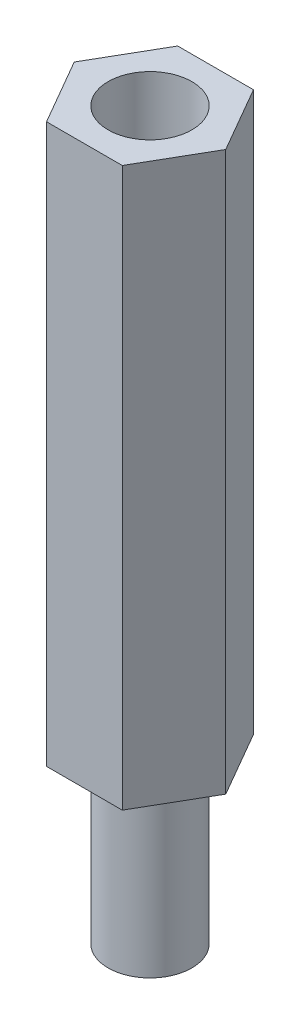
ISO-10303-21;
HEADER;
FILE_DESCRIPTION(('STEP AP214'),'2;1');
FILE_NAME('part.step','',(''),(''),'','','');
FILE_SCHEMA(('AUTOMOTIVE_DESIGN { 1 0 10303 214 1 1 1 1 }'));
ENDSEC;
DATA;
#1=APPLICATION_CONTEXT('core data for automotive mechanical design processes');
#2=APPLICATION_PROTOCOL_DEFINITION('international standard','automotive_design',2000,#1);
#3=PRODUCT_CONTEXT('',#1,'mechanical');
#4=PRODUCT('Part','Part','',(#3));
#5=PRODUCT_RELATED_PRODUCT_CATEGORY('part','',(#4));
#6=PRODUCT_DEFINITION_FORMATION('','',#4);
#7=PRODUCT_DEFINITION_CONTEXT('part definition',#1,'design');
#8=PRODUCT_DEFINITION('design','',#6,#7);
#9=PRODUCT_DEFINITION_SHAPE('','',#8);
#10=(LENGTH_UNIT() NAMED_UNIT(*) SI_UNIT(.MILLI.,.METRE.));
#11=(NAMED_UNIT(*) PLANE_ANGLE_UNIT() SI_UNIT($,.RADIAN.));
#12=(NAMED_UNIT(*) SI_UNIT($,.STERADIAN.) SOLID_ANGLE_UNIT());
#13=UNCERTAINTY_MEASURE_WITH_UNIT(LENGTH_MEASURE(1.E-05),#10,'distance_accuracy_value','');
#14=(GEOMETRIC_REPRESENTATION_CONTEXT(3) GLOBAL_UNCERTAINTY_ASSIGNED_CONTEXT((#13)) GLOBAL_UNIT_ASSIGNED_CONTEXT((#10,
#11,#12)) REPRESENTATION_CONTEXT('',''));
#15=CARTESIAN_POINT('',(0.,0.,0.));
#16=DIRECTION('',(0.,0.,1.));
#17=DIRECTION('',(1.,0.,0.));
#18=AXIS2_PLACEMENT_3D('',#15,#16,#17);
#19=CARTESIAN_POINT('',(0.,-6.,0.));
#20=DIRECTION('',(0.,1.,0.));
#21=DIRECTION('',(0.,0.,1.));
#22=AXIS2_PLACEMENT_3D('',#19,#20,#21);
#23=CYLINDRICAL_SURFACE('',#22,1.5);
#24=CARTESIAN_POINT('',(0.,-6.,0.));
#25=DIRECTION('',(0.,-1.,0.));
#26=DIRECTION('',(0.,0.,-1.));
#27=AXIS2_PLACEMENT_3D('',#24,#25,#26);
#28=CIRCLE('',#27,1.5);
#29=CARTESIAN_POINT('',(0.,-6.,-1.5));
#30=VERTEX_POINT('',#29);
#31=EDGE_CURVE('E11',#30,#30,#28,.T.);
#32=ORIENTED_EDGE('',*,*,#31,.F.);
#33=EDGE_LOOP('',(#32));
#34=FACE_BOUND('',#33,.T.);
#35=CARTESIAN_POINT('',(0.,0.,0.));
#36=DIRECTION('',(0.,-1.,0.));
#37=DIRECTION('',(0.,0.,-1.));
#38=AXIS2_PLACEMENT_3D('',#35,#36,#37);
#39=CIRCLE('',#38,1.5);
#40=CARTESIAN_POINT('',(0.,0.,-1.5));
#41=VERTEX_POINT('',#40);
#42=EDGE_CURVE('E46',#41,#41,#39,.T.);
#43=ORIENTED_EDGE('',*,*,#42,.T.);
#44=EDGE_LOOP('',(#43));
#45=FACE_BOUND('',#44,.T.);
#46=ADVANCED_FACE('F43',(#34,#45),#23,.T.);
#47=CARTESIAN_POINT('',(0.,-6.,0.));
#48=DIRECTION('',(0.,-1.,0.));
#49=DIRECTION('',(0.,0.,-1.));
#50=AXIS2_PLACEMENT_3D('',#47,#48,#49);
#51=PLANE('',#50);
#52=ORIENTED_EDGE('',*,*,#31,.T.);
#53=EDGE_LOOP('',(#52));
#54=FACE_BOUND('',#53,.T.);
#55=ADVANCED_FACE('F58',(#54),#51,.T.);
#56=CARTESIAN_POINT('',(0.,0.,0.));
#57=DIRECTION('',(0.,-1.,0.));
#58=DIRECTION('',(0.,0.,-1.));
#59=AXIS2_PLACEMENT_3D('',#56,#57,#58);
#60=PLANE('',#59);
#61=ORIENTED_EDGE('',*,*,#42,.F.);
#62=EDGE_LOOP('',(#61));
#63=FACE_BOUND('',#62,.T.);
#64=ADVANCED_FACE('F56',(#63),#60,.F.);
#65=CLOSED_SHELL('',(#46,#55,#64));
#66=MANIFOLD_SOLID_BREP('B2',#65);
#67=CARTESIAN_POINT('',(0.,20.,0.));
#68=DIRECTION('',(0.,1.,0.));
#69=DIRECTION('',(0.,0.,1.));
#70=AXIS2_PLACEMENT_3D('',#67,#68,#69);
#71=PLANE('',#70);
#72=DIRECTION('',(0.5,0.,-0.866025403784439));
#73=VECTOR('',#72,1.);
#74=CARTESIAN_POINT('',(1.35677313259562,20.,2.35));
#75=LINE('',#74,#73);
#76=CARTESIAN_POINT('',(1.35677313259562,20.,2.35));
#77=VERTEX_POINT('',#76);
#78=CARTESIAN_POINT('',(2.71354626519124,20.,0.));
#79=VERTEX_POINT('',#78);
#80=EDGE_CURVE('E180',#77,#79,#75,.T.);
#81=ORIENTED_EDGE('',*,*,#80,.T.);
#82=DIRECTION('',(-0.5,0.,-0.866025403784439));
#83=VECTOR('',#82,1.);
#84=CARTESIAN_POINT('',(2.71354626519124,20.,0.));
#85=LINE('',#84,#83);
#86=CARTESIAN_POINT('',(1.35677313259562,20.,-2.35));
#87=VERTEX_POINT('',#86);
#88=EDGE_CURVE('E138',#79,#87,#85,.T.);
#89=ORIENTED_EDGE('',*,*,#88,.T.);
#90=DIRECTION('',(-1.,0.,0.));
#91=VECTOR('',#90,1.);
#92=CARTESIAN_POINT('',(1.35677313259562,20.,-2.35));
#93=LINE('',#92,#91);
#94=CARTESIAN_POINT('',(-1.35677313259562,20.,-2.35));
#95=VERTEX_POINT('',#94);
#96=EDGE_CURVE('E151',#87,#95,#93,.T.);
#97=ORIENTED_EDGE('',*,*,#96,.T.);
#98=DIRECTION('',(-0.5,0.,0.866025403784439));
#99=VECTOR('',#98,1.);
#100=CARTESIAN_POINT('',(-1.35677313259562,20.,-2.35));
#101=LINE('',#100,#99);
#102=CARTESIAN_POINT('',(-2.71354626519124,20.,0.));
#103=VERTEX_POINT('',#102);
#104=EDGE_CURVE('E145',#95,#103,#101,.T.);
#105=ORIENTED_EDGE('',*,*,#104,.T.);
#106=DIRECTION('',(0.5,0.,0.866025403784439));
#107=VECTOR('',#106,1.);
#108=CARTESIAN_POINT('',(-2.71354626519124,20.,0.));
#109=LINE('',#108,#107);
#110=CARTESIAN_POINT('',(-1.35677313259562,20.,2.35));
#111=VERTEX_POINT('',#110);
#112=EDGE_CURVE('E149',#103,#111,#109,.T.);
#113=ORIENTED_EDGE('',*,*,#112,.T.);
#114=DIRECTION('',(1.,0.,0.));
#115=VECTOR('',#114,1.);
#116=CARTESIAN_POINT('',(-1.35677313259562,20.,2.35));
#117=LINE('',#116,#115);
#118=EDGE_CURVE('E101',#111,#77,#117,.T.);
#119=ORIENTED_EDGE('',*,*,#118,.T.);
#120=EDGE_LOOP('',(#81,#89,#97,#105,#113,#119));
#121=FACE_BOUND('',#120,.T.);
#122=CARTESIAN_POINT('',(0.,20.,0.));
#123=DIRECTION('',(0.,1.,0.));
#124=DIRECTION('',(0.,0.,1.));
#125=AXIS2_PLACEMENT_3D('',#122,#123,#124);
#126=CIRCLE('',#125,1.5);
#127=CARTESIAN_POINT('',(0.,20.,1.5));
#128=VERTEX_POINT('',#127);
#129=EDGE_CURVE('E173',#128,#128,#126,.T.);
#130=ORIENTED_EDGE('',*,*,#129,.F.);
#131=EDGE_LOOP('',(#130));
#132=FACE_BOUND('',#131,.T.);
#133=ADVANCED_FACE('F84',(#121,#132),#71,.T.);
#134=CARTESIAN_POINT('',(0.,0.,0.));
#135=DIRECTION('',(0.,1.,0.));
#136=DIRECTION('',(0.,0.,1.));
#137=AXIS2_PLACEMENT_3D('',#134,#135,#136);
#138=PLANE('',#137);
#139=DIRECTION('',(0.5,0.,-0.866025403784439));
#140=VECTOR('',#139,1.);
#141=CARTESIAN_POINT('',(1.35677313259562,0.,2.35));
#142=LINE('',#141,#140);
#143=CARTESIAN_POINT('',(1.35677313259562,0.,2.35));
#144=VERTEX_POINT('',#143);
#145=CARTESIAN_POINT('',(2.71354626519124,0.,0.));
#146=VERTEX_POINT('',#145);
#147=EDGE_CURVE('E169',#144,#146,#142,.T.);
#148=ORIENTED_EDGE('',*,*,#147,.F.);
#149=DIRECTION('',(1.,0.,0.));
#150=VECTOR('',#149,1.);
#151=CARTESIAN_POINT('',(-1.35677313259562,0.,2.35));
#152=LINE('',#151,#150);
#153=CARTESIAN_POINT('',(-1.35677313259562,0.,2.35));
#154=VERTEX_POINT('',#153);
#155=EDGE_CURVE('E130',#154,#144,#152,.T.);
#156=ORIENTED_EDGE('',*,*,#155,.F.);
#157=DIRECTION('',(0.5,0.,0.866025403784439));
#158=VECTOR('',#157,1.);
#159=CARTESIAN_POINT('',(-2.71354626519124,0.,0.));
#160=LINE('',#159,#158);
#161=CARTESIAN_POINT('',(-2.71354626519124,0.,0.));
#162=VERTEX_POINT('',#161);
#163=EDGE_CURVE('E124',#162,#154,#160,.T.);
#164=ORIENTED_EDGE('',*,*,#163,.F.);
#165=DIRECTION('',(-0.5,0.,0.866025403784439));
#166=VECTOR('',#165,1.);
#167=CARTESIAN_POINT('',(-1.35677313259562,0.,-2.35));
#168=LINE('',#167,#166);
#169=CARTESIAN_POINT('',(-1.35677313259562,0.,-2.35));
#170=VERTEX_POINT('',#169);
#171=EDGE_CURVE('E159',#170,#162,#168,.T.);
#172=ORIENTED_EDGE('',*,*,#171,.F.);
#173=DIRECTION('',(-1.,0.,0.));
#174=VECTOR('',#173,1.);
#175=CARTESIAN_POINT('',(1.35677313259562,0.,-2.35));
#176=LINE('',#175,#174);
#177=CARTESIAN_POINT('',(1.35677313259562,0.,-2.35));
#178=VERTEX_POINT('',#177);
#179=EDGE_CURVE('E175',#178,#170,#176,.T.);
#180=ORIENTED_EDGE('',*,*,#179,.F.);
#181=DIRECTION('',(-0.5,0.,-0.866025403784439));
#182=VECTOR('',#181,1.);
#183=CARTESIAN_POINT('',(2.71354626519124,0.,0.));
#184=LINE('',#183,#182);
#185=EDGE_CURVE('E172',#146,#178,#184,.T.);
#186=ORIENTED_EDGE('',*,*,#185,.F.);
#187=EDGE_LOOP('',(#148,#156,#164,#172,#180,#186));
#188=FACE_BOUND('',#187,.T.);
#189=CARTESIAN_POINT('',(0.,0.,0.));
#190=DIRECTION('',(0.,1.,0.));
#191=DIRECTION('',(0.,0.,1.));
#192=AXIS2_PLACEMENT_3D('',#189,#190,#191);
#193=CIRCLE('',#192,1.5);
#194=CARTESIAN_POINT('',(0.,0.,1.5));
#195=VERTEX_POINT('',#194);
#196=EDGE_CURVE('E273',#195,#195,#193,.T.);
#197=ORIENTED_EDGE('',*,*,#196,.T.);
#198=EDGE_LOOP('',(#197));
#199=FACE_BOUND('',#198,.T.);
#200=ADVANCED_FACE('F189',(#188,#199),#138,.F.);
#201=CARTESIAN_POINT('',(1.35677313259562,20.,2.35));
#202=DIRECTION('',(-0.866025403784439,0.,-0.5));
#203=DIRECTION('',(-0.5,0.,0.866025403784439));
#204=AXIS2_PLACEMENT_3D('',#201,#202,#203);
#205=PLANE('',#204);
#206=ORIENTED_EDGE('',*,*,#147,.T.);
#207=DIRECTION('',(0.,-1.,0.));
#208=VECTOR('',#207,1.);
#209=CARTESIAN_POINT('',(2.71354626519124,20.,0.));
#210=LINE('',#209,#208);
#211=EDGE_CURVE('E41',#79,#146,#210,.T.);
#212=ORIENTED_EDGE('',*,*,#211,.F.);
#213=ORIENTED_EDGE('',*,*,#80,.F.);
#214=DIRECTION('',(0.,-1.,0.));
#215=VECTOR('',#214,1.);
#216=CARTESIAN_POINT('',(1.35677313259562,20.,2.35));
#217=LINE('',#216,#215);
#218=EDGE_CURVE('E165',#77,#144,#217,.T.);
#219=ORIENTED_EDGE('',*,*,#218,.T.);
#220=EDGE_LOOP('',(#206,#212,#213,#219));
#221=FACE_BOUND('',#220,.T.);
#222=ADVANCED_FACE('F86',(#221),#205,.F.);
#223=CARTESIAN_POINT('',(2.71354626519124,20.,0.));
#224=DIRECTION('',(-0.866025403784439,0.,0.5));
#225=DIRECTION('',(0.5,0.,0.866025403784439));
#226=AXIS2_PLACEMENT_3D('',#223,#224,#225);
#227=PLANE('',#226);
#228=ORIENTED_EDGE('',*,*,#185,.T.);
#229=DIRECTION('',(0.,-1.,0.));
#230=VECTOR('',#229,1.);
#231=CARTESIAN_POINT('',(1.35677313259562,20.,-2.35));
#232=LINE('',#231,#230);
#233=EDGE_CURVE('E93',#87,#178,#232,.T.);
#234=ORIENTED_EDGE('',*,*,#233,.F.);
#235=ORIENTED_EDGE('',*,*,#88,.F.);
#236=ORIENTED_EDGE('',*,*,#211,.T.);
#237=EDGE_LOOP('',(#228,#234,#235,#236));
#238=FACE_BOUND('',#237,.T.);
#239=ADVANCED_FACE('F214',(#238),#227,.F.);
#240=CARTESIAN_POINT('',(1.35677313259562,20.,-2.35));
#241=DIRECTION('',(0.,0.,1.));
#242=DIRECTION('',(1.,0.,0.));
#243=AXIS2_PLACEMENT_3D('',#240,#241,#242);
#244=PLANE('',#243);
#245=ORIENTED_EDGE('',*,*,#179,.T.);
#246=DIRECTION('',(0.,-1.,0.));
#247=VECTOR('',#246,1.);
#248=CARTESIAN_POINT('',(-1.35677313259562,20.,-2.35));
#249=LINE('',#248,#247);
#250=EDGE_CURVE('E160',#95,#170,#249,.T.);
#251=ORIENTED_EDGE('',*,*,#250,.F.);
#252=ORIENTED_EDGE('',*,*,#96,.F.);
#253=ORIENTED_EDGE('',*,*,#233,.T.);
#254=EDGE_LOOP('',(#245,#251,#252,#253));
#255=FACE_BOUND('',#254,.T.);
#256=ADVANCED_FACE('F186',(#255),#244,.F.);
#257=CARTESIAN_POINT('',(-1.35677313259562,20.,-2.35));
#258=DIRECTION('',(0.866025403784439,0.,0.5));
#259=DIRECTION('',(0.5,0.,-0.866025403784439));
#260=AXIS2_PLACEMENT_3D('',#257,#258,#259);
#261=PLANE('',#260);
#262=ORIENTED_EDGE('',*,*,#171,.T.);
#263=DIRECTION('',(0.,-1.,0.));
#264=VECTOR('',#263,1.);
#265=CARTESIAN_POINT('',(-2.71354626519124,20.,0.));
#266=LINE('',#265,#264);
#267=EDGE_CURVE('E156',#103,#162,#266,.T.);
#268=ORIENTED_EDGE('',*,*,#267,.F.);
#269=ORIENTED_EDGE('',*,*,#104,.F.);
#270=ORIENTED_EDGE('',*,*,#250,.T.);
#271=EDGE_LOOP('',(#262,#268,#269,#270));
#272=FACE_BOUND('',#271,.T.);
#273=ADVANCED_FACE('F157',(#272),#261,.F.);
#274=CARTESIAN_POINT('',(-2.71354626519124,20.,0.));
#275=DIRECTION('',(0.866025403784439,0.,-0.5));
#276=DIRECTION('',(-0.5,0.,-0.866025403784439));
#277=AXIS2_PLACEMENT_3D('',#274,#275,#276);
#278=PLANE('',#277);
#279=ORIENTED_EDGE('',*,*,#163,.T.);
#280=DIRECTION('',(0.,-1.,0.));
#281=VECTOR('',#280,1.);
#282=CARTESIAN_POINT('',(-1.35677313259562,20.,2.35));
#283=LINE('',#282,#281);
#284=EDGE_CURVE('E161',#111,#154,#283,.T.);
#285=ORIENTED_EDGE('',*,*,#284,.F.);
#286=ORIENTED_EDGE('',*,*,#112,.F.);
#287=ORIENTED_EDGE('',*,*,#267,.T.);
#288=EDGE_LOOP('',(#279,#285,#286,#287));
#289=FACE_BOUND('',#288,.T.);
#290=ADVANCED_FACE('F163',(#289),#278,.F.);
#291=CARTESIAN_POINT('',(-1.35677313259562,20.,2.35));
#292=DIRECTION('',(0.,0.,-1.));
#293=DIRECTION('',(-1.,0.,0.));
#294=AXIS2_PLACEMENT_3D('',#291,#292,#293);
#295=PLANE('',#294);
#296=ORIENTED_EDGE('',*,*,#155,.T.);
#297=ORIENTED_EDGE('',*,*,#218,.F.);
#298=ORIENTED_EDGE('',*,*,#118,.F.);
#299=ORIENTED_EDGE('',*,*,#284,.T.);
#300=EDGE_LOOP('',(#296,#297,#298,#299));
#301=FACE_BOUND('',#300,.T.);
#302=ADVANCED_FACE('F194',(#301),#295,.F.);
#303=CARTESIAN_POINT('',(0.,20.,0.));
#304=DIRECTION('',(0.,-1.,0.));
#305=DIRECTION('',(0.,0.,-1.));
#306=AXIS2_PLACEMENT_3D('',#303,#304,#305);
#307=CYLINDRICAL_SURFACE('',#306,1.5);
#308=ORIENTED_EDGE('',*,*,#129,.T.);
#309=EDGE_LOOP('',(#308));
#310=FACE_BOUND('',#309,.T.);
#311=ORIENTED_EDGE('',*,*,#196,.F.);
#312=EDGE_LOOP('',(#311));
#313=FACE_BOUND('',#312,.T.);
#314=ADVANCED_FACE('F196',(#310,#313),#307,.F.);
#315=CLOSED_SHELL('',(#133,#200,#222,#239,#256,#273,#290,#302,#314));
#316=MANIFOLD_SOLID_BREP('B6',#315);
#317=ADVANCED_BREP_SHAPE_REPRESENTATION('',(#18,#66,#316),#14);
#318=SHAPE_DEFINITION_REPRESENTATION(#9,#317);
ENDSEC;
END-ISO-10303-21;
